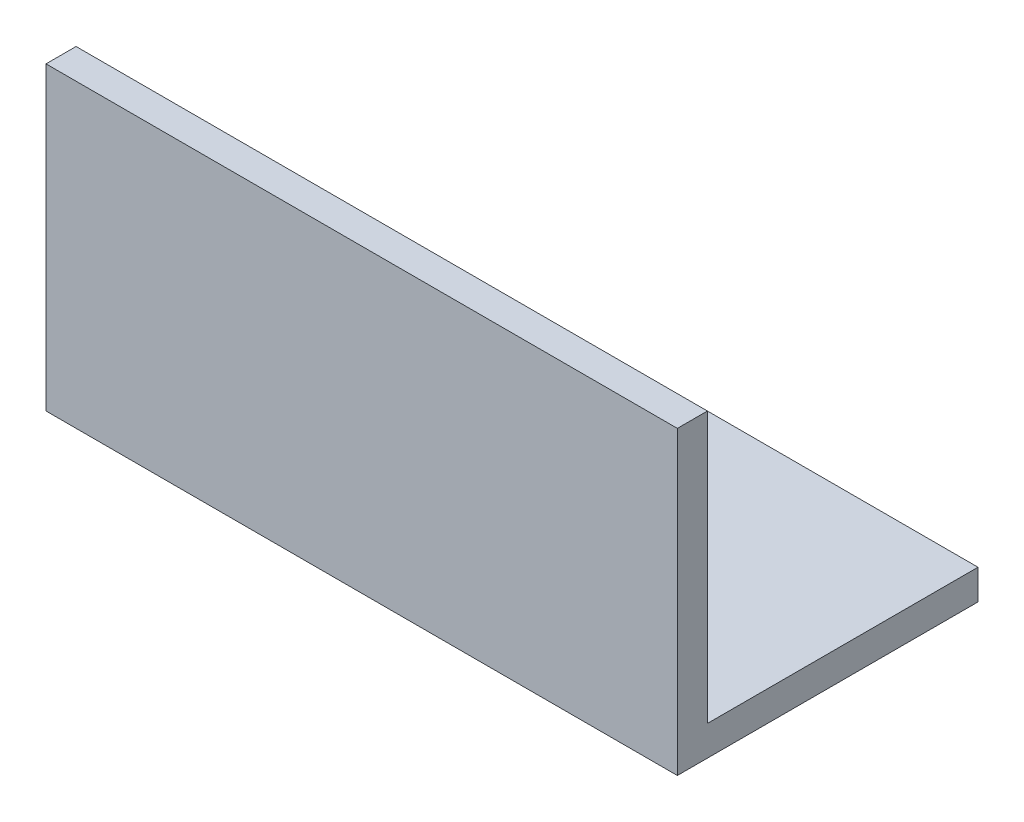
ISO-10303-21;
HEADER;
FILE_DESCRIPTION(('STEP AP214'),'2;1');
FILE_NAME('part.step','',(''),(''),'','','');
FILE_SCHEMA(('AUTOMOTIVE_DESIGN { 1 0 10303 214 1 1 1 1 }'));
ENDSEC;
DATA;
#1=APPLICATION_CONTEXT('core data for automotive mechanical design processes');
#2=APPLICATION_PROTOCOL_DEFINITION('international standard','automotive_design',2000,#1);
#3=PRODUCT_CONTEXT('',#1,'mechanical');
#4=PRODUCT('Part','Part','',(#3));
#5=PRODUCT_RELATED_PRODUCT_CATEGORY('part','',(#4));
#6=PRODUCT_DEFINITION_FORMATION('','',#4);
#7=PRODUCT_DEFINITION_CONTEXT('part definition',#1,'design');
#8=PRODUCT_DEFINITION('design','',#6,#7);
#9=PRODUCT_DEFINITION_SHAPE('','',#8);
#10=(LENGTH_UNIT() NAMED_UNIT(*) SI_UNIT(.MILLI.,.METRE.));
#11=(NAMED_UNIT(*) PLANE_ANGLE_UNIT() SI_UNIT($,.RADIAN.));
#12=(NAMED_UNIT(*) SI_UNIT($,.STERADIAN.) SOLID_ANGLE_UNIT());
#13=UNCERTAINTY_MEASURE_WITH_UNIT(LENGTH_MEASURE(1.E-05),#10,'distance_accuracy_value','');
#14=(GEOMETRIC_REPRESENTATION_CONTEXT(3) GLOBAL_UNCERTAINTY_ASSIGNED_CONTEXT((#13)) GLOBAL_UNIT_ASSIGNED_CONTEXT((#10,
#11,#12)) REPRESENTATION_CONTEXT('',''));
#15=CARTESIAN_POINT('',(0.,0.,0.));
#16=DIRECTION('',(0.,0.,1.));
#17=DIRECTION('',(1.,0.,0.));
#18=AXIS2_PLACEMENT_3D('',#15,#16,#17);
#19=CARTESIAN_POINT('',(-42.,20.,-2.));
#20=DIRECTION('',(0.,1.,0.));
#21=DIRECTION('',(0.,0.,1.));
#22=AXIS2_PLACEMENT_3D('',#19,#20,#21);
#23=PLANE('',#22);
#24=DIRECTION('',(0.,0.,1.));
#25=VECTOR('',#24,1.);
#26=CARTESIAN_POINT('',(0.,20.,-2.));
#27=LINE('',#26,#25);
#28=CARTESIAN_POINT('',(0.,20.,-2.));
#29=VERTEX_POINT('',#28);
#30=CARTESIAN_POINT('',(0.,20.,0.));
#31=VERTEX_POINT('',#30);
#32=EDGE_CURVE('E124',#29,#31,#27,.T.);
#33=ORIENTED_EDGE('',*,*,#32,.F.);
#34=DIRECTION('',(1.,0.,0.));
#35=VECTOR('',#34,1.);
#36=CARTESIAN_POINT('',(-42.,20.,-2.));
#37=LINE('',#36,#35);
#38=CARTESIAN_POINT('',(-42.,20.,-2.));
#39=VERTEX_POINT('',#38);
#40=EDGE_CURVE('E11',#39,#29,#37,.T.);
#41=ORIENTED_EDGE('',*,*,#40,.F.);
#42=DIRECTION('',(0.,0.,1.));
#43=VECTOR('',#42,1.);
#44=CARTESIAN_POINT('',(-42.,20.,-2.));
#45=LINE('',#44,#43);
#46=CARTESIAN_POINT('',(-42.,20.,0.));
#47=VERTEX_POINT('',#46);
#48=EDGE_CURVE('E139',#39,#47,#45,.T.);
#49=ORIENTED_EDGE('',*,*,#48,.T.);
#50=DIRECTION('',(1.,0.,0.));
#51=VECTOR('',#50,1.);
#52=CARTESIAN_POINT('',(-42.,20.,0.));
#53=LINE('',#52,#51);
#54=EDGE_CURVE('E42',#47,#31,#53,.T.);
#55=ORIENTED_EDGE('',*,*,#54,.T.);
#56=EDGE_LOOP('',(#33,#41,#49,#55));
#57=FACE_BOUND('',#56,.T.);
#58=ADVANCED_FACE('F39',(#57),#23,.T.);
#59=CARTESIAN_POINT('',(-42.,2.,-2.));
#60=DIRECTION('',(0.,0.,-1.));
#61=DIRECTION('',(0.,1.,0.));
#62=AXIS2_PLACEMENT_3D('',#59,#60,#61);
#63=PLANE('',#62);
#64=DIRECTION('',(0.,1.,0.));
#65=VECTOR('',#64,1.);
#66=CARTESIAN_POINT('',(0.,2.,-2.));
#67=LINE('',#66,#65);
#68=CARTESIAN_POINT('',(0.,2.,-2.));
#69=VERTEX_POINT('',#68);
#70=EDGE_CURVE('E137',#69,#29,#67,.T.);
#71=ORIENTED_EDGE('',*,*,#70,.F.);
#72=DIRECTION('',(1.,0.,0.));
#73=VECTOR('',#72,1.);
#74=CARTESIAN_POINT('',(-42.,2.,-2.));
#75=LINE('',#74,#73);
#76=CARTESIAN_POINT('',(-42.,2.,-2.));
#77=VERTEX_POINT('',#76);
#78=EDGE_CURVE('E48',#77,#69,#75,.T.);
#79=ORIENTED_EDGE('',*,*,#78,.F.);
#80=DIRECTION('',(0.,1.,0.));
#81=VECTOR('',#80,1.);
#82=CARTESIAN_POINT('',(-42.,2.,-2.));
#83=LINE('',#82,#81);
#84=EDGE_CURVE('E114',#77,#39,#83,.T.);
#85=ORIENTED_EDGE('',*,*,#84,.T.);
#86=ORIENTED_EDGE('',*,*,#40,.T.);
#87=EDGE_LOOP('',(#71,#79,#85,#86));
#88=FACE_BOUND('',#87,.T.);
#89=ADVANCED_FACE('F147',(#88),#63,.T.);
#90=CARTESIAN_POINT('',(-42.,2.,-20.));
#91=DIRECTION('',(0.,1.,0.));
#92=DIRECTION('',(0.,0.,1.));
#93=AXIS2_PLACEMENT_3D('',#90,#91,#92);
#94=PLANE('',#93);
#95=CARTESIAN_POINT('',(-21.,2.,-15.2618715863952));
#96=DIRECTION('',(0.,1.,0.));
#97=DIRECTION('',(0.,0.,1.));
#98=AXIS2_PLACEMENT_3D('',#95,#96,#97);
#99=CIRCLE('',#98,1.26449395817532);
#100=CARTESIAN_POINT('',(-21.,2.,-13.9973776282199));
#101=VERTEX_POINT('',#100);
#102=EDGE_CURVE('E194',#101,#101,#99,.T.);
#103=ORIENTED_EDGE('',*,*,#102,.F.);
#104=EDGE_LOOP('',(#103));
#105=FACE_BOUND('',#104,.T.);
#106=CARTESIAN_POINT('',(-16.7381284136048,2.,-11.));
#107=DIRECTION('',(0.,1.,0.));
#108=DIRECTION('',(0.,0.,1.));
#109=AXIS2_PLACEMENT_3D('',#106,#107,#108);
#110=CIRCLE('',#109,1.26449395817532);
#111=CARTESIAN_POINT('',(-16.7381284136048,2.,-9.73550604182469));
#112=VERTEX_POINT('',#111);
#113=EDGE_CURVE('E195',#112,#112,#110,.T.);
#114=ORIENTED_EDGE('',*,*,#113,.F.);
#115=EDGE_LOOP('',(#114));
#116=FACE_BOUND('',#115,.T.);
#117=CARTESIAN_POINT('',(-21.,2.,-6.73812841360483));
#118=DIRECTION('',(0.,1.,0.));
#119=DIRECTION('',(0.,0.,1.));
#120=AXIS2_PLACEMENT_3D('',#117,#118,#119);
#121=CIRCLE('',#120,1.26449395817532);
#122=CARTESIAN_POINT('',(-21.,2.,-5.47363445542951));
#123=VERTEX_POINT('',#122);
#124=EDGE_CURVE('E204',#123,#123,#121,.T.);
#125=ORIENTED_EDGE('',*,*,#124,.F.);
#126=EDGE_LOOP('',(#125));
#127=FACE_BOUND('',#126,.T.);
#128=CARTESIAN_POINT('',(-25.2618715863952,2.,-11.));
#129=DIRECTION('',(0.,1.,0.));
#130=DIRECTION('',(0.,0.,1.));
#131=AXIS2_PLACEMENT_3D('',#128,#129,#130);
#132=CIRCLE('',#131,1.26449395817532);
#133=CARTESIAN_POINT('',(-25.2618715863952,2.,-9.73550604182468));
#134=VERTEX_POINT('',#133);
#135=EDGE_CURVE('E210',#134,#134,#132,.T.);
#136=ORIENTED_EDGE('',*,*,#135,.F.);
#137=EDGE_LOOP('',(#136));
#138=FACE_BOUND('',#137,.T.);
#139=DIRECTION('',(0.,0.,1.));
#140=VECTOR('',#139,1.);
#141=CARTESIAN_POINT('',(0.,2.,-20.));
#142=LINE('',#141,#140);
#143=CARTESIAN_POINT('',(0.,2.,-20.));
#144=VERTEX_POINT('',#143);
#145=EDGE_CURVE('E101',#144,#69,#142,.T.);
#146=ORIENTED_EDGE('',*,*,#145,.F.);
#147=DIRECTION('',(1.,0.,0.));
#148=VECTOR('',#147,1.);
#149=CARTESIAN_POINT('',(-42.,2.,-20.));
#150=LINE('',#149,#148);
#151=CARTESIAN_POINT('',(-42.,2.,-20.));
#152=VERTEX_POINT('',#151);
#153=EDGE_CURVE('E96',#152,#144,#150,.T.);
#154=ORIENTED_EDGE('',*,*,#153,.F.);
#155=DIRECTION('',(0.,0.,1.));
#156=VECTOR('',#155,1.);
#157=CARTESIAN_POINT('',(-42.,2.,-20.));
#158=LINE('',#157,#156);
#159=EDGE_CURVE('E99',#152,#77,#158,.T.);
#160=ORIENTED_EDGE('',*,*,#159,.T.);
#161=ORIENTED_EDGE('',*,*,#78,.T.);
#162=EDGE_LOOP('',(#146,#154,#160,#161));
#163=FACE_BOUND('',#162,.T.);
#164=ADVANCED_FACE('F98',(#105,#116,#127,#138,#163),#94,.T.);
#165=CARTESIAN_POINT('',(-42.,0.,-20.));
#166=DIRECTION('',(0.,0.,-1.));
#167=DIRECTION('',(-1.,0.,0.));
#168=AXIS2_PLACEMENT_3D('',#165,#166,#167);
#169=PLANE('',#168);
#170=DIRECTION('',(0.,1.,0.));
#171=VECTOR('',#170,1.);
#172=CARTESIAN_POINT('',(0.,0.,-20.));
#173=LINE('',#172,#171);
#174=CARTESIAN_POINT('',(0.,0.,-20.));
#175=VERTEX_POINT('',#174);
#176=EDGE_CURVE('E134',#175,#144,#173,.T.);
#177=ORIENTED_EDGE('',*,*,#176,.F.);
#178=DIRECTION('',(1.,0.,0.));
#179=VECTOR('',#178,1.);
#180=CARTESIAN_POINT('',(-42.,0.,-20.));
#181=LINE('',#180,#179);
#182=CARTESIAN_POINT('',(-42.,0.,-20.));
#183=VERTEX_POINT('',#182);
#184=EDGE_CURVE('E106',#183,#175,#181,.T.);
#185=ORIENTED_EDGE('',*,*,#184,.F.);
#186=DIRECTION('',(0.,1.,0.));
#187=VECTOR('',#186,1.);
#188=CARTESIAN_POINT('',(-42.,0.,-20.));
#189=LINE('',#188,#187);
#190=EDGE_CURVE('E112',#183,#152,#189,.T.);
#191=ORIENTED_EDGE('',*,*,#190,.T.);
#192=ORIENTED_EDGE('',*,*,#153,.T.);
#193=EDGE_LOOP('',(#177,#185,#191,#192));
#194=FACE_BOUND('',#193,.T.);
#195=ADVANCED_FACE('F116',(#194),#169,.T.);
#196=CARTESIAN_POINT('',(-42.,0.,0.));
#197=DIRECTION('',(0.,-1.,0.));
#198=DIRECTION('',(0.,0.,-1.));
#199=AXIS2_PLACEMENT_3D('',#196,#197,#198);
#200=PLANE('',#199);
#201=CARTESIAN_POINT('',(-21.,0.,-15.2618715863952));
#202=DIRECTION('',(0.,1.,0.));
#203=DIRECTION('',(0.,0.,1.));
#204=AXIS2_PLACEMENT_3D('',#201,#202,#203);
#205=CIRCLE('',#204,1.26449395817532);
#206=CARTESIAN_POINT('',(-21.,0.,-13.9973776282199));
#207=VERTEX_POINT('',#206);
#208=EDGE_CURVE('E128',#207,#207,#205,.T.);
#209=ORIENTED_EDGE('',*,*,#208,.T.);
#210=EDGE_LOOP('',(#209));
#211=FACE_BOUND('',#210,.T.);
#212=CARTESIAN_POINT('',(-16.7381284136048,0.,-11.));
#213=DIRECTION('',(0.,1.,0.));
#214=DIRECTION('',(0.,0.,1.));
#215=AXIS2_PLACEMENT_3D('',#212,#213,#214);
#216=CIRCLE('',#215,1.26449395817532);
#217=CARTESIAN_POINT('',(-16.7381284136048,0.,-9.73550604182469));
#218=VERTEX_POINT('',#217);
#219=EDGE_CURVE('E199',#218,#218,#216,.T.);
#220=ORIENTED_EDGE('',*,*,#219,.T.);
#221=EDGE_LOOP('',(#220));
#222=FACE_BOUND('',#221,.T.);
#223=CARTESIAN_POINT('',(-21.,0.,-6.73812841360483));
#224=DIRECTION('',(0.,1.,0.));
#225=DIRECTION('',(0.,0.,1.));
#226=AXIS2_PLACEMENT_3D('',#223,#224,#225);
#227=CIRCLE('',#226,1.26449395817532);
#228=CARTESIAN_POINT('',(-21.,0.,-5.47363445542951));
#229=VERTEX_POINT('',#228);
#230=EDGE_CURVE('E207',#229,#229,#227,.T.);
#231=ORIENTED_EDGE('',*,*,#230,.T.);
#232=EDGE_LOOP('',(#231));
#233=FACE_BOUND('',#232,.T.);
#234=CARTESIAN_POINT('',(-25.2618715863952,0.,-11.));
#235=DIRECTION('',(0.,1.,0.));
#236=DIRECTION('',(0.,0.,1.));
#237=AXIS2_PLACEMENT_3D('',#234,#235,#236);
#238=CIRCLE('',#237,1.26449395817532);
#239=CARTESIAN_POINT('',(-25.2618715863952,0.,-9.73550604182468));
#240=VERTEX_POINT('',#239);
#241=EDGE_CURVE('E213',#240,#240,#238,.T.);
#242=ORIENTED_EDGE('',*,*,#241,.T.);
#243=EDGE_LOOP('',(#242));
#244=FACE_BOUND('',#243,.T.);
#245=DIRECTION('',(0.,0.,-1.));
#246=VECTOR('',#245,1.);
#247=CARTESIAN_POINT('',(0.,0.,0.));
#248=LINE('',#247,#246);
#249=CARTESIAN_POINT('',(0.,0.,0.));
#250=VERTEX_POINT('',#249);
#251=EDGE_CURVE('E131',#250,#175,#248,.T.);
#252=ORIENTED_EDGE('',*,*,#251,.F.);
#253=DIRECTION('',(1.,0.,0.));
#254=VECTOR('',#253,1.);
#255=CARTESIAN_POINT('',(-42.,0.,0.));
#256=LINE('',#255,#254);
#257=CARTESIAN_POINT('',(-42.,0.,0.));
#258=VERTEX_POINT('',#257);
#259=EDGE_CURVE('E142',#258,#250,#256,.T.);
#260=ORIENTED_EDGE('',*,*,#259,.F.);
#261=DIRECTION('',(0.,0.,-1.));
#262=VECTOR('',#261,1.);
#263=CARTESIAN_POINT('',(-42.,0.,0.));
#264=LINE('',#263,#262);
#265=EDGE_CURVE('E117',#258,#183,#264,.T.);
#266=ORIENTED_EDGE('',*,*,#265,.T.);
#267=ORIENTED_EDGE('',*,*,#184,.T.);
#268=EDGE_LOOP('',(#252,#260,#266,#267));
#269=FACE_BOUND('',#268,.T.);
#270=ADVANCED_FACE('F161',(#211,#222,#233,#244,#269),#200,.T.);
#271=CARTESIAN_POINT('',(-42.,20.,0.));
#272=DIRECTION('',(0.,0.,1.));
#273=DIRECTION('',(1.,0.,0.));
#274=AXIS2_PLACEMENT_3D('',#271,#272,#273);
#275=PLANE('',#274);
#276=DIRECTION('',(0.,-1.,0.));
#277=VECTOR('',#276,1.);
#278=CARTESIAN_POINT('',(0.,20.,0.));
#279=LINE('',#278,#277);
#280=EDGE_CURVE('E127',#31,#250,#279,.T.);
#281=ORIENTED_EDGE('',*,*,#280,.F.);
#282=ORIENTED_EDGE('',*,*,#54,.F.);
#283=DIRECTION('',(0.,-1.,0.));
#284=VECTOR('',#283,1.);
#285=CARTESIAN_POINT('',(-42.,20.,0.));
#286=LINE('',#285,#284);
#287=EDGE_CURVE('E119',#47,#258,#286,.T.);
#288=ORIENTED_EDGE('',*,*,#287,.T.);
#289=ORIENTED_EDGE('',*,*,#259,.T.);
#290=EDGE_LOOP('',(#281,#282,#288,#289));
#291=FACE_BOUND('',#290,.T.);
#292=ADVANCED_FACE('F144',(#291),#275,.T.);
#293=CARTESIAN_POINT('',(-42.,0.,0.));
#294=DIRECTION('',(1.,0.,0.));
#295=DIRECTION('',(0.,0.,-1.));
#296=AXIS2_PLACEMENT_3D('',#293,#294,#295);
#297=PLANE('',#296);
#298=ORIENTED_EDGE('',*,*,#48,.F.);
#299=ORIENTED_EDGE('',*,*,#84,.F.);
#300=ORIENTED_EDGE('',*,*,#159,.F.);
#301=ORIENTED_EDGE('',*,*,#190,.F.);
#302=ORIENTED_EDGE('',*,*,#265,.F.);
#303=ORIENTED_EDGE('',*,*,#287,.F.);
#304=EDGE_LOOP('',(#298,#299,#300,#301,#302,#303));
#305=FACE_BOUND('',#304,.T.);
#306=ADVANCED_FACE('F110',(#305),#297,.F.);
#307=CARTESIAN_POINT('',(0.,0.,0.));
#308=DIRECTION('',(1.,0.,0.));
#309=DIRECTION('',(0.,0.,-1.));
#310=AXIS2_PLACEMENT_3D('',#307,#308,#309);
#311=PLANE('',#310);
#312=ORIENTED_EDGE('',*,*,#32,.T.);
#313=ORIENTED_EDGE('',*,*,#280,.T.);
#314=ORIENTED_EDGE('',*,*,#251,.T.);
#315=ORIENTED_EDGE('',*,*,#176,.T.);
#316=ORIENTED_EDGE('',*,*,#145,.T.);
#317=ORIENTED_EDGE('',*,*,#70,.T.);
#318=EDGE_LOOP('',(#312,#313,#314,#315,#316,#317));
#319=FACE_BOUND('',#318,.T.);
#320=ADVANCED_FACE('F146',(#319),#311,.T.);
#321=CARTESIAN_POINT('',(-25.2618715863952,0.,-11.));
#322=DIRECTION('',(0.,1.,0.));
#323=DIRECTION('',(0.,0.,1.));
#324=AXIS2_PLACEMENT_3D('',#321,#322,#323);
#325=CYLINDRICAL_SURFACE('',#324,1.26449395817532);
#326=ORIENTED_EDGE('',*,*,#241,.F.);
#327=EDGE_LOOP('',(#326));
#328=FACE_BOUND('',#327,.T.);
#329=ORIENTED_EDGE('',*,*,#135,.T.);
#330=EDGE_LOOP('',(#329));
#331=FACE_BOUND('',#330,.T.);
#332=ADVANCED_FACE('F171',(#328,#331),#325,.F.);
#333=CARTESIAN_POINT('',(-21.,0.,-6.73812841360483));
#334=DIRECTION('',(0.,1.,0.));
#335=DIRECTION('',(0.,0.,1.));
#336=AXIS2_PLACEMENT_3D('',#333,#334,#335);
#337=CYLINDRICAL_SURFACE('',#336,1.26449395817532);
#338=ORIENTED_EDGE('',*,*,#230,.F.);
#339=EDGE_LOOP('',(#338));
#340=FACE_BOUND('',#339,.T.);
#341=ORIENTED_EDGE('',*,*,#124,.T.);
#342=EDGE_LOOP('',(#341));
#343=FACE_BOUND('',#342,.T.);
#344=ADVANCED_FACE('F175',(#340,#343),#337,.F.);
#345=CARTESIAN_POINT('',(-16.7381284136048,0.,-11.));
#346=DIRECTION('',(0.,1.,0.));
#347=DIRECTION('',(0.,0.,1.));
#348=AXIS2_PLACEMENT_3D('',#345,#346,#347);
#349=CYLINDRICAL_SURFACE('',#348,1.26449395817532);
#350=ORIENTED_EDGE('',*,*,#219,.F.);
#351=EDGE_LOOP('',(#350));
#352=FACE_BOUND('',#351,.T.);
#353=ORIENTED_EDGE('',*,*,#113,.T.);
#354=EDGE_LOOP('',(#353));
#355=FACE_BOUND('',#354,.T.);
#356=ADVANCED_FACE('F179',(#352,#355),#349,.F.);
#357=CARTESIAN_POINT('',(-21.,0.,-15.2618715863952));
#358=DIRECTION('',(0.,1.,0.));
#359=DIRECTION('',(0.,0.,1.));
#360=AXIS2_PLACEMENT_3D('',#357,#358,#359);
#361=CYLINDRICAL_SURFACE('',#360,1.26449395817532);
#362=ORIENTED_EDGE('',*,*,#208,.F.);
#363=EDGE_LOOP('',(#362));
#364=FACE_BOUND('',#363,.T.);
#365=ORIENTED_EDGE('',*,*,#102,.T.);
#366=EDGE_LOOP('',(#365));
#367=FACE_BOUND('',#366,.T.);
#368=ADVANCED_FACE('F183',(#364,#367),#361,.F.);
#369=CLOSED_SHELL('',(#58,#89,#164,#195,#270,#292,#306,#320,#332,#344,#356,#368));
#370=MANIFOLD_SOLID_BREP('B2',#369);
#371=ADVANCED_BREP_SHAPE_REPRESENTATION('',(#18,#370),#14);
#372=SHAPE_DEFINITION_REPRESENTATION(#9,#371);
ENDSEC;
END-ISO-10303-21;
